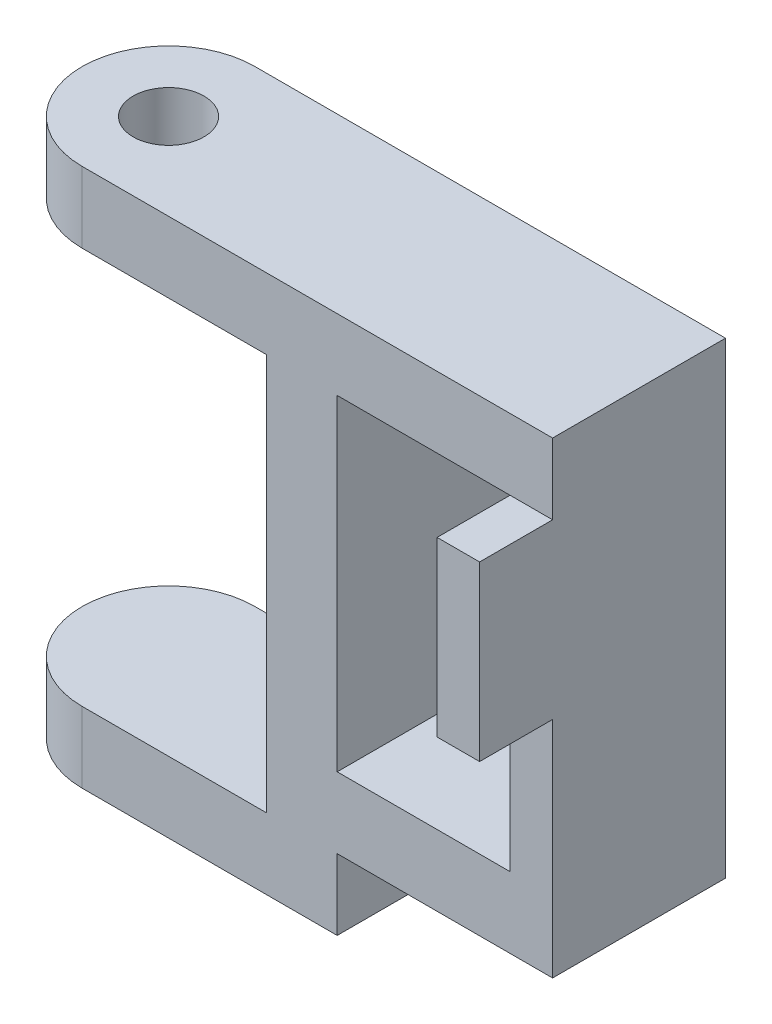
ISO-10303-21;
HEADER;
FILE_DESCRIPTION(('STEP AP214'),'2;1');
FILE_NAME('part.step','',(''),(''),'','','');
FILE_SCHEMA(('AUTOMOTIVE_DESIGN { 1 0 10303 214 1 1 1 1 }'));
ENDSEC;
DATA;
#1=APPLICATION_CONTEXT('core data for automotive mechanical design processes');
#2=APPLICATION_PROTOCOL_DEFINITION('international standard','automotive_design',2000,#1);
#3=PRODUCT_CONTEXT('',#1,'mechanical');
#4=PRODUCT('Part','Part','',(#3));
#5=PRODUCT_RELATED_PRODUCT_CATEGORY('part','',(#4));
#6=PRODUCT_DEFINITION_FORMATION('','',#4);
#7=PRODUCT_DEFINITION_CONTEXT('part definition',#1,'design');
#8=PRODUCT_DEFINITION('design','',#6,#7);
#9=PRODUCT_DEFINITION_SHAPE('','',#8);
#10=(LENGTH_UNIT() NAMED_UNIT(*) SI_UNIT(.MILLI.,.METRE.));
#11=(NAMED_UNIT(*) PLANE_ANGLE_UNIT() SI_UNIT($,.RADIAN.));
#12=(NAMED_UNIT(*) SI_UNIT($,.STERADIAN.) SOLID_ANGLE_UNIT());
#13=UNCERTAINTY_MEASURE_WITH_UNIT(LENGTH_MEASURE(1.E-05),#10,'distance_accuracy_value','');
#14=(GEOMETRIC_REPRESENTATION_CONTEXT(3) GLOBAL_UNCERTAINTY_ASSIGNED_CONTEXT((#13)) GLOBAL_UNIT_ASSIGNED_CONTEXT((#10,
#11,#12)) REPRESENTATION_CONTEXT('',''));
#15=CARTESIAN_POINT('',(0.,0.,0.));
#16=DIRECTION('',(0.,0.,1.));
#17=DIRECTION('',(1.,0.,0.));
#18=AXIS2_PLACEMENT_3D('',#15,#16,#17);
#19=CARTESIAN_POINT('',(0.,0.,12.2));
#20=DIRECTION('',(0.,0.,1.));
#21=DIRECTION('',(1.,0.,0.));
#22=AXIS2_PLACEMENT_3D('',#19,#20,#21);
#23=PLANE('',#22);
#24=DIRECTION('',(0.,-1.,0.));
#25=VECTOR('',#24,1.);
#26=CARTESIAN_POINT('',(-1.10788192656431,-6.58682111786425,12.2));
#27=LINE('',#26,#25);
#28=CARTESIAN_POINT('',(-1.10788192656431,9.21411364004409,12.2));
#29=VERTEX_POINT('',#28);
#30=CARTESIAN_POINT('',(-1.10788192656431,-6.58682111786425,12.2));
#31=VERTEX_POINT('',#30);
#32=EDGE_CURVE('E220',#29,#31,#27,.T.);
#33=ORIENTED_EDGE('',*,*,#32,.F.);
#34=DIRECTION('',(1.,0.,0.));
#35=VECTOR('',#34,1.);
#36=CARTESIAN_POINT('',(-4.10788192656431,9.21411364004409,12.2));
#37=LINE('',#36,#35);
#38=CARTESIAN_POINT('',(-4.10788192656431,9.21411364004409,12.2));
#39=VERTEX_POINT('',#38);
#40=EDGE_CURVE('E636',#39,#29,#37,.T.);
#41=ORIENTED_EDGE('',*,*,#40,.F.);
#42=DIRECTION('',(0.,1.,0.));
#43=VECTOR('',#42,1.);
#44=CARTESIAN_POINT('',(-4.10788192656431,-14.5888211178643,12.2));
#45=LINE('',#44,#43);
#46=CARTESIAN_POINT('',(-4.10788192656431,-1.58682111786425,12.2));
#47=VERTEX_POINT('',#46);
#48=EDGE_CURVE('E196',#47,#39,#45,.T.);
#49=ORIENTED_EDGE('',*,*,#48,.F.);
#50=DIRECTION('',(-1.,0.,0.));
#51=VECTOR('',#50,1.);
#52=CARTESIAN_POINT('',(-1.10788192656431,-1.58682111786425,12.2));
#53=LINE('',#52,#51);
#54=CARTESIAN_POINT('',(-16.3078819265643,-1.58682111786425,12.2));
#55=VERTEX_POINT('',#54);
#56=EDGE_CURVE('E69',#47,#55,#53,.T.);
#57=ORIENTED_EDGE('',*,*,#56,.T.);
#58=DIRECTION('',(0.,1.,0.));
#59=VECTOR('',#58,1.);
#60=CARTESIAN_POINT('',(-16.3078819265643,26.4131788821357,12.2));
#61=LINE('',#60,#59);
#62=CARTESIAN_POINT('',(-16.3078819265643,21.4141136400441,12.2));
#63=VERTEX_POINT('',#62);
#64=EDGE_CURVE('E308',#55,#63,#61,.T.);
#65=ORIENTED_EDGE('',*,*,#64,.T.);
#66=DIRECTION('',(-1.,0.,0.));
#67=VECTOR('',#66,1.);
#68=CARTESIAN_POINT('',(-1.10788192656431,21.4141136400441,12.2));
#69=LINE('',#68,#67);
#70=CARTESIAN_POINT('',(-4.10788192656431,21.4141136400441,12.2));
#71=VERTEX_POINT('',#70);
#72=EDGE_CURVE('E61',#71,#63,#69,.T.);
#73=ORIENTED_EDGE('',*,*,#72,.F.);
#74=DIRECTION('',(-1.,0.,0.));
#75=VECTOR('',#74,1.);
#76=CARTESIAN_POINT('',(-4.10788192656431,21.4141136400441,12.2));
#77=LINE('',#76,#75);
#78=CARTESIAN_POINT('',(-1.10788192656431,21.4141136400441,12.2));
#79=VERTEX_POINT('',#78);
#80=EDGE_CURVE('E192',#79,#71,#77,.T.);
#81=ORIENTED_EDGE('',*,*,#80,.F.);
#82=CARTESIAN_POINT('',(-1.10788192656431,26.4131788821357,12.2));
#83=VERTEX_POINT('',#82);
#84=EDGE_CURVE('E215',#83,#79,#27,.T.);
#85=ORIENTED_EDGE('',*,*,#84,.F.);
#86=DIRECTION('',(-1.,0.,0.));
#87=VECTOR('',#86,1.);
#88=CARTESIAN_POINT('',(-40.4078819265643,26.4131788821357,12.2));
#89=LINE('',#88,#87);
#90=CARTESIAN_POINT('',(-34.3078819265643,26.4131788821357,12.2));
#91=VERTEX_POINT('',#90);
#92=EDGE_CURVE('E313',#83,#91,#89,.T.);
#93=ORIENTED_EDGE('',*,*,#92,.T.);
#94=DIRECTION('',(0.,-1.,0.));
#95=VECTOR('',#94,1.);
#96=CARTESIAN_POINT('',(-34.3078819265643,90.9412032566802,12.2));
#97=LINE('',#96,#95);
#98=CARTESIAN_POINT('',(-34.3078819265643,21.4131788821357,12.2));
#99=VERTEX_POINT('',#98);
#100=EDGE_CURVE('E270',#91,#99,#97,.T.);
#101=ORIENTED_EDGE('',*,*,#100,.T.);
#102=DIRECTION('',(1.,0.,0.));
#103=VECTOR('',#102,1.);
#104=CARTESIAN_POINT('',(-40.4078819265643,21.4131788821357,12.2));
#105=LINE('',#104,#103);
#106=CARTESIAN_POINT('',(-21.3078819265643,21.4131788821357,12.2));
#107=VERTEX_POINT('',#106);
#108=EDGE_CURVE('E294',#99,#107,#105,.T.);
#109=ORIENTED_EDGE('',*,*,#108,.T.);
#110=DIRECTION('',(0.,-1.,0.));
#111=VECTOR('',#110,1.);
#112=CARTESIAN_POINT('',(-21.3078819265643,21.4131788821357,12.2));
#113=LINE('',#112,#111);
#114=CARTESIAN_POINT('',(-21.3078819265643,-6.58682111786425,12.2));
#115=VERTEX_POINT('',#114);
#116=EDGE_CURVE('E297',#107,#115,#113,.T.);
#117=ORIENTED_EDGE('',*,*,#116,.T.);
#118=DIRECTION('',(-1.,0.,0.));
#119=VECTOR('',#118,1.);
#120=CARTESIAN_POINT('',(-21.3078819265643,-6.58682111786425,12.2));
#121=LINE('',#120,#119);
#122=CARTESIAN_POINT('',(-34.3078819265643,-6.58682111786425,12.2));
#123=VERTEX_POINT('',#122);
#124=EDGE_CURVE('E301',#115,#123,#121,.T.);
#125=ORIENTED_EDGE('',*,*,#124,.T.);
#126=CARTESIAN_POINT('',(-34.3078819265643,-11.5868211178643,12.2));
#127=VERTEX_POINT('',#126);
#128=EDGE_CURVE('E263',#123,#127,#97,.T.);
#129=ORIENTED_EDGE('',*,*,#128,.T.);
#130=DIRECTION('',(1.,0.,0.));
#131=VECTOR('',#130,1.);
#132=CARTESIAN_POINT('',(-16.3078819265643,-11.5868211178643,12.2));
#133=LINE('',#132,#131);
#134=CARTESIAN_POINT('',(-16.3078819265643,-11.5868211178643,12.2));
#135=VERTEX_POINT('',#134);
#136=EDGE_CURVE('E305',#127,#135,#133,.T.);
#137=ORIENTED_EDGE('',*,*,#136,.T.);
#138=CARTESIAN_POINT('',(-16.3078819265643,-6.58682111786425,12.2));
#139=VERTEX_POINT('',#138);
#140=EDGE_CURVE('E309',#135,#139,#61,.T.);
#141=ORIENTED_EDGE('',*,*,#140,.T.);
#142=DIRECTION('',(-1.,0.,0.));
#143=VECTOR('',#142,1.);
#144=CARTESIAN_POINT('',(-1.10788192656431,-6.58682111786425,12.2));
#145=LINE('',#144,#143);
#146=EDGE_CURVE('E244',#31,#139,#145,.T.);
#147=ORIENTED_EDGE('',*,*,#146,.F.);
#148=EDGE_LOOP('',(#33,#41,#49,#57,#65,#73,#81,#85,#93,#101,#109,#117,#125,#129,#137,#141,#147));
#149=FACE_BOUND('',#148,.T.);
#150=ADVANCED_FACE('F45',(#149),#23,.T.);
#151=CARTESIAN_POINT('',(-16.3078819265643,26.4131788821357,12.2));
#152=DIRECTION('',(-1.,0.,0.));
#153=DIRECTION('',(0.,-1.,0.));
#154=AXIS2_PLACEMENT_3D('',#151,#152,#153);
#155=PLANE('',#154);
#156=DIRECTION('',(0.,0.,1.));
#157=VECTOR('',#156,1.);
#158=CARTESIAN_POINT('',(-16.3078819265643,-1.58682111786425,12.2));
#159=LINE('',#158,#157);
#160=CARTESIAN_POINT('',(-16.3078819265643,-1.58682111786425,0.));
#161=VERTEX_POINT('',#160);
#162=EDGE_CURVE('E230',#161,#55,#159,.T.);
#163=ORIENTED_EDGE('',*,*,#162,.F.);
#164=DIRECTION('',(0.,1.,0.));
#165=VECTOR('',#164,1.);
#166=CARTESIAN_POINT('',(-16.3078819265643,26.4131788821357,0.));
#167=LINE('',#166,#165);
#168=CARTESIAN_POINT('',(-16.3078819265643,21.4141136400441,0.));
#169=VERTEX_POINT('',#168);
#170=EDGE_CURVE('E330',#161,#169,#167,.T.);
#171=ORIENTED_EDGE('',*,*,#170,.T.);
#172=DIRECTION('',(0.,0.,-1.));
#173=VECTOR('',#172,1.);
#174=CARTESIAN_POINT('',(-16.3078819265643,21.4141136400441,12.2));
#175=LINE('',#174,#173);
#176=EDGE_CURVE('E231',#63,#169,#175,.T.);
#177=ORIENTED_EDGE('',*,*,#176,.F.);
#178=ORIENTED_EDGE('',*,*,#64,.F.);
#179=EDGE_LOOP('',(#163,#171,#177,#178));
#180=FACE_BOUND('',#179,.T.);
#181=ADVANCED_FACE('F408',(#180),#155,.F.);
#182=DIRECTION('',(0.,0.,-1.));
#183=VECTOR('',#182,1.);
#184=CARTESIAN_POINT('',(-16.3078819265643,-6.58682111786425,12.2));
#185=LINE('',#184,#183);
#186=CARTESIAN_POINT('',(-16.3078819265643,-6.58682111786425,0.));
#187=VERTEX_POINT('',#186);
#188=EDGE_CURVE('E226',#139,#187,#185,.T.);
#189=ORIENTED_EDGE('',*,*,#188,.F.);
#190=ORIENTED_EDGE('',*,*,#140,.F.);
#191=DIRECTION('',(0.,0.,-1.));
#192=VECTOR('',#191,1.);
#193=CARTESIAN_POINT('',(-16.3078819265643,-11.5868211178643,12.2));
#194=LINE('',#193,#192);
#195=CARTESIAN_POINT('',(-16.3078819265643,-11.5868211178643,0.));
#196=VERTEX_POINT('',#195);
#197=EDGE_CURVE('E317',#135,#196,#194,.T.);
#198=ORIENTED_EDGE('',*,*,#197,.T.);
#199=EDGE_CURVE('E331',#196,#187,#167,.T.);
#200=ORIENTED_EDGE('',*,*,#199,.T.);
#201=EDGE_LOOP('',(#189,#190,#198,#200));
#202=FACE_BOUND('',#201,.T.);
#203=ADVANCED_FACE('F388',(#202),#155,.F.);
#204=CARTESIAN_POINT('',(-40.4078819265643,21.4131788821357,12.2));
#205=DIRECTION('',(0.,1.,0.));
#206=DIRECTION('',(0.,0.,1.));
#207=AXIS2_PLACEMENT_3D('',#204,#205,#206);
#208=PLANE('',#207);
#209=CARTESIAN_POINT('',(-34.3078819265643,21.4131788821357,6.1));
#210=DIRECTION('',(0.,1.,0.));
#211=DIRECTION('',(0.,0.,1.));
#212=AXIS2_PLACEMENT_3D('',#209,#210,#211);
#213=CIRCLE('',#212,2.49999999999999);
#214=CARTESIAN_POINT('',(-34.3078819265643,21.4131788821357,8.59999999999999));
#215=VERTEX_POINT('',#214);
#216=EDGE_CURVE('E286',#215,#215,#213,.T.);
#217=ORIENTED_EDGE('',*,*,#216,.T.);
#218=EDGE_LOOP('',(#217));
#219=FACE_BOUND('',#218,.T.);
#220=CARTESIAN_POINT('',(-34.3078819265643,21.4131788821357,6.1));
#221=DIRECTION('',(0.,1.,0.));
#222=DIRECTION('',(0.,0.,1.));
#223=AXIS2_PLACEMENT_3D('',#220,#221,#222);
#224=CIRCLE('',#223,6.1);
#225=CARTESIAN_POINT('',(-34.3078819265643,21.4131788821357,0.));
#226=VERTEX_POINT('',#225);
#227=EDGE_CURVE('E281',#226,#99,#224,.T.);
#228=ORIENTED_EDGE('',*,*,#227,.F.);
#229=DIRECTION('',(1.,0.,0.));
#230=VECTOR('',#229,1.);
#231=CARTESIAN_POINT('',(-40.4078819265643,21.4131788821357,0.));
#232=LINE('',#231,#230);
#233=CARTESIAN_POINT('',(-21.3078819265643,21.4131788821357,0.));
#234=VERTEX_POINT('',#233);
#235=EDGE_CURVE('E290',#226,#234,#232,.T.);
#236=ORIENTED_EDGE('',*,*,#235,.T.);
#237=DIRECTION('',(0.,0.,-1.));
#238=VECTOR('',#237,1.);
#239=CARTESIAN_POINT('',(-21.3078819265643,21.4131788821357,12.2));
#240=LINE('',#239,#238);
#241=EDGE_CURVE('E343',#107,#234,#240,.T.);
#242=ORIENTED_EDGE('',*,*,#241,.F.);
#243=ORIENTED_EDGE('',*,*,#108,.F.);
#244=EDGE_LOOP('',(#228,#236,#242,#243));
#245=FACE_BOUND('',#244,.T.);
#246=ADVANCED_FACE('F47',(#219,#245),#208,.F.);
#247=CARTESIAN_POINT('',(-21.3078819265643,-6.58682111786425,12.2));
#248=DIRECTION('',(0.,-1.,0.));
#249=DIRECTION('',(1.,0.,0.));
#250=AXIS2_PLACEMENT_3D('',#247,#248,#249);
#251=PLANE('',#250);
#252=CARTESIAN_POINT('',(-34.3078819265643,-6.58682111786425,6.1));
#253=DIRECTION('',(0.,-1.,0.));
#254=DIRECTION('',(1.,0.,0.));
#255=AXIS2_PLACEMENT_3D('',#252,#253,#254);
#256=CIRCLE('',#255,6.1);
#257=CARTESIAN_POINT('',(-34.3078819265643,-6.58682111786425,0.));
#258=VERTEX_POINT('',#257);
#259=EDGE_CURVE('E278',#123,#258,#256,.T.);
#260=ORIENTED_EDGE('',*,*,#259,.F.);
#261=ORIENTED_EDGE('',*,*,#124,.F.);
#262=DIRECTION('',(0.,0.,-1.));
#263=VECTOR('',#262,1.);
#264=CARTESIAN_POINT('',(-21.3078819265643,-6.58682111786425,12.2));
#265=LINE('',#264,#263);
#266=CARTESIAN_POINT('',(-21.3078819265643,-6.58682111786425,0.));
#267=VERTEX_POINT('',#266);
#268=EDGE_CURVE('E340',#115,#267,#265,.T.);
#269=ORIENTED_EDGE('',*,*,#268,.T.);
#270=DIRECTION('',(-1.,0.,0.));
#271=VECTOR('',#270,1.);
#272=CARTESIAN_POINT('',(-21.3078819265643,-6.58682111786425,0.));
#273=LINE('',#272,#271);
#274=EDGE_CURVE('E323',#267,#258,#273,.T.);
#275=ORIENTED_EDGE('',*,*,#274,.T.);
#276=EDGE_LOOP('',(#260,#261,#269,#275));
#277=FACE_BOUND('',#276,.T.);
#278=ADVANCED_FACE('F363',(#277),#251,.F.);
#279=CARTESIAN_POINT('',(-16.3078819265643,-11.5868211178643,12.2));
#280=DIRECTION('',(0.,1.,0.));
#281=DIRECTION('',(-1.,0.,0.));
#282=AXIS2_PLACEMENT_3D('',#279,#280,#281);
#283=PLANE('',#282);
#284=CARTESIAN_POINT('',(-34.3078819265643,-11.5868211178643,6.1));
#285=DIRECTION('',(0.,1.,0.));
#286=DIRECTION('',(-1.,0.,0.));
#287=AXIS2_PLACEMENT_3D('',#284,#285,#286);
#288=CIRCLE('',#287,2.);
#289=CARTESIAN_POINT('',(-36.3078819265643,-11.5868211178643,6.1));
#290=VERTEX_POINT('',#289);
#291=EDGE_CURVE('E11',#290,#290,#288,.F.);
#292=ORIENTED_EDGE('',*,*,#291,.F.);
#293=EDGE_LOOP('',(#292));
#294=FACE_BOUND('',#293,.T.);
#295=CARTESIAN_POINT('',(-34.3078819265643,-11.5868211178643,6.1));
#296=DIRECTION('',(0.,1.,0.));
#297=DIRECTION('',(-1.,0.,0.));
#298=AXIS2_PLACEMENT_3D('',#295,#296,#297);
#299=CIRCLE('',#298,6.1);
#300=CARTESIAN_POINT('',(-34.3078819265643,-11.5868211178643,0.));
#301=VERTEX_POINT('',#300);
#302=EDGE_CURVE('E274',#301,#127,#299,.T.);
#303=ORIENTED_EDGE('',*,*,#302,.F.);
#304=DIRECTION('',(1.,0.,0.));
#305=VECTOR('',#304,1.);
#306=CARTESIAN_POINT('',(-16.3078819265643,-11.5868211178643,0.));
#307=LINE('',#306,#305);
#308=EDGE_CURVE('E327',#301,#196,#307,.T.);
#309=ORIENTED_EDGE('',*,*,#308,.T.);
#310=ORIENTED_EDGE('',*,*,#197,.F.);
#311=ORIENTED_EDGE('',*,*,#136,.F.);
#312=EDGE_LOOP('',(#303,#309,#310,#311));
#313=FACE_BOUND('',#312,.T.);
#314=ADVANCED_FACE('F392',(#294,#313),#283,.F.);
#315=CARTESIAN_POINT('',(-40.4078819265643,26.4131788821357,12.2));
#316=DIRECTION('',(0.,-1.,0.));
#317=DIRECTION('',(0.,0.,-1.));
#318=AXIS2_PLACEMENT_3D('',#315,#316,#317);
#319=PLANE('',#318);
#320=CARTESIAN_POINT('',(-34.3078819265643,26.4131788821357,6.1));
#321=DIRECTION('',(0.,1.,0.));
#322=DIRECTION('',(0.,0.,1.));
#323=AXIS2_PLACEMENT_3D('',#320,#321,#322);
#324=CIRCLE('',#323,2.49999999999999);
#325=CARTESIAN_POINT('',(-34.3078819265643,26.4131788821357,8.59999999999999));
#326=VERTEX_POINT('',#325);
#327=EDGE_CURVE('E285',#326,#326,#324,.T.);
#328=ORIENTED_EDGE('',*,*,#327,.F.);
#329=EDGE_LOOP('',(#328));
#330=FACE_BOUND('',#329,.T.);
#331=CARTESIAN_POINT('',(-34.3078819265643,26.4131788821357,6.1));
#332=DIRECTION('',(0.,-1.,0.));
#333=DIRECTION('',(0.,0.,-1.));
#334=AXIS2_PLACEMENT_3D('',#331,#332,#333);
#335=CIRCLE('',#334,6.1);
#336=CARTESIAN_POINT('',(-34.3078819265643,26.4131788821357,0.));
#337=VERTEX_POINT('',#336);
#338=EDGE_CURVE('E271',#91,#337,#335,.T.);
#339=ORIENTED_EDGE('',*,*,#338,.F.);
#340=ORIENTED_EDGE('',*,*,#92,.F.);
#341=DIRECTION('',(0.,0.,1.));
#342=VECTOR('',#341,1.);
#343=CARTESIAN_POINT('',(-1.10788192656431,26.4131788821357,12.2));
#344=LINE('',#343,#342);
#345=CARTESIAN_POINT('',(-1.10788192656431,26.4131788821357,0.));
#346=VERTEX_POINT('',#345);
#347=EDGE_CURVE('E254',#346,#83,#344,.T.);
#348=ORIENTED_EDGE('',*,*,#347,.F.);
#349=DIRECTION('',(-1.,0.,0.));
#350=VECTOR('',#349,1.);
#351=CARTESIAN_POINT('',(-40.4078819265643,26.4131788821357,0.));
#352=LINE('',#351,#350);
#353=EDGE_CURVE('E298',#346,#337,#352,.T.);
#354=ORIENTED_EDGE('',*,*,#353,.T.);
#355=EDGE_LOOP('',(#339,#340,#348,#354));
#356=FACE_BOUND('',#355,.T.);
#357=ADVANCED_FACE('F376',(#330,#356),#319,.F.);
#358=CARTESIAN_POINT('',(0.,0.,0.));
#359=DIRECTION('',(0.,0.,1.));
#360=DIRECTION('',(1.,0.,0.));
#361=AXIS2_PLACEMENT_3D('',#358,#359,#360);
#362=PLANE('',#361);
#363=DIRECTION('',(0.,1.,0.));
#364=VECTOR('',#363,1.);
#365=CARTESIAN_POINT('',(-4.10788192656431,-14.5888211178643,0.));
#366=LINE('',#365,#364);
#367=CARTESIAN_POINT('',(-4.10788192656431,-1.58682111786425,0.));
#368=VERTEX_POINT('',#367);
#369=CARTESIAN_POINT('',(-4.10788192656431,21.4141136400441,0.));
#370=VERTEX_POINT('',#369);
#371=EDGE_CURVE('E202',#368,#370,#366,.T.);
#372=ORIENTED_EDGE('',*,*,#371,.T.);
#373=DIRECTION('',(-1.,0.,0.));
#374=VECTOR('',#373,1.);
#375=CARTESIAN_POINT('',(-1.10788192656431,21.4141136400441,0.));
#376=LINE('',#375,#374);
#377=EDGE_CURVE('E251',#370,#169,#376,.T.);
#378=ORIENTED_EDGE('',*,*,#377,.T.);
#379=ORIENTED_EDGE('',*,*,#170,.F.);
#380=DIRECTION('',(-1.,0.,0.));
#381=VECTOR('',#380,1.);
#382=CARTESIAN_POINT('',(-1.10788192656431,-1.58682111786425,0.));
#383=LINE('',#382,#381);
#384=EDGE_CURVE('E237',#368,#161,#383,.T.);
#385=ORIENTED_EDGE('',*,*,#384,.F.);
#386=EDGE_LOOP('',(#372,#378,#379,#385));
#387=FACE_BOUND('',#386,.T.);
#388=DIRECTION('',(0.,-1.,0.));
#389=VECTOR('',#388,1.);
#390=CARTESIAN_POINT('',(-34.3078819265643,90.9412032566802,0.));
#391=LINE('',#390,#389);
#392=EDGE_CURVE('E54',#337,#226,#391,.T.);
#393=ORIENTED_EDGE('',*,*,#392,.F.);
#394=ORIENTED_EDGE('',*,*,#353,.F.);
#395=DIRECTION('',(0.,1.,0.));
#396=VECTOR('',#395,1.);
#397=CARTESIAN_POINT('',(-1.10788192656431,-6.58682111786425,0.));
#398=LINE('',#397,#396);
#399=CARTESIAN_POINT('',(-1.10788192656431,-6.58682111786425,0.));
#400=VERTEX_POINT('',#399);
#401=EDGE_CURVE('E223',#400,#346,#398,.T.);
#402=ORIENTED_EDGE('',*,*,#401,.F.);
#403=DIRECTION('',(-1.,0.,0.));
#404=VECTOR('',#403,1.);
#405=CARTESIAN_POINT('',(-1.10788192656431,-6.58682111786425,0.));
#406=LINE('',#405,#404);
#407=EDGE_CURVE('E240',#400,#187,#406,.T.);
#408=ORIENTED_EDGE('',*,*,#407,.T.);
#409=ORIENTED_EDGE('',*,*,#199,.F.);
#410=ORIENTED_EDGE('',*,*,#308,.F.);
#411=EDGE_CURVE('E267',#258,#301,#391,.T.);
#412=ORIENTED_EDGE('',*,*,#411,.F.);
#413=ORIENTED_EDGE('',*,*,#274,.F.);
#414=DIRECTION('',(0.,-1.,0.));
#415=VECTOR('',#414,1.);
#416=CARTESIAN_POINT('',(-21.3078819265643,21.4131788821357,0.));
#417=LINE('',#416,#415);
#418=EDGE_CURVE('E320',#234,#267,#417,.T.);
#419=ORIENTED_EDGE('',*,*,#418,.F.);
#420=ORIENTED_EDGE('',*,*,#235,.F.);
#421=EDGE_LOOP('',(#393,#394,#402,#408,#409,#410,#412,#413,#419,#420));
#422=FACE_BOUND('',#421,.T.);
#423=ADVANCED_FACE('F360',(#387,#422),#362,.F.);
#424=CARTESIAN_POINT('',(-21.3078819265643,21.4131788821357,12.2));
#425=DIRECTION('',(1.,0.,0.));
#426=DIRECTION('',(0.,1.,0.));
#427=AXIS2_PLACEMENT_3D('',#424,#425,#426);
#428=PLANE('',#427);
#429=ORIENTED_EDGE('',*,*,#418,.T.);
#430=ORIENTED_EDGE('',*,*,#268,.F.);
#431=ORIENTED_EDGE('',*,*,#116,.F.);
#432=ORIENTED_EDGE('',*,*,#241,.T.);
#433=EDGE_LOOP('',(#429,#430,#431,#432));
#434=FACE_BOUND('',#433,.T.);
#435=ADVANCED_FACE('F366',(#434),#428,.F.);
#436=CARTESIAN_POINT('',(-34.3078819265643,21.4131788821357,6.1));
#437=DIRECTION('',(0.,1.,0.));
#438=DIRECTION('',(0.,0.,1.));
#439=AXIS2_PLACEMENT_3D('',#436,#437,#438);
#440=CYLINDRICAL_SURFACE('',#439,2.49999999999999);
#441=ORIENTED_EDGE('',*,*,#216,.F.);
#442=EDGE_LOOP('',(#441));
#443=FACE_BOUND('',#442,.T.);
#444=ORIENTED_EDGE('',*,*,#327,.T.);
#445=EDGE_LOOP('',(#444));
#446=FACE_BOUND('',#445,.T.);
#447=ADVANCED_FACE('F418',(#443,#446),#440,.F.);
#448=CARTESIAN_POINT('',(-34.3078819265643,90.9412032566802,6.1));
#449=DIRECTION('',(0.,-1.,0.));
#450=DIRECTION('',(0.,0.,-1.));
#451=AXIS2_PLACEMENT_3D('',#448,#449,#450);
#452=CYLINDRICAL_SURFACE('',#451,6.1);
#453=ORIENTED_EDGE('',*,*,#338,.T.);
#454=ORIENTED_EDGE('',*,*,#392,.T.);
#455=ORIENTED_EDGE('',*,*,#227,.T.);
#456=ORIENTED_EDGE('',*,*,#100,.F.);
#457=EDGE_LOOP('',(#453,#454,#455,#456));
#458=FACE_BOUND('',#457,.T.);
#459=ADVANCED_FACE('F371',(#458),#452,.T.);
#460=ORIENTED_EDGE('',*,*,#128,.F.);
#461=ORIENTED_EDGE('',*,*,#259,.T.);
#462=ORIENTED_EDGE('',*,*,#411,.T.);
#463=ORIENTED_EDGE('',*,*,#302,.T.);
#464=EDGE_LOOP('',(#460,#461,#462,#463));
#465=FACE_BOUND('',#464,.T.);
#466=ADVANCED_FACE('F355',(#465),#452,.T.);
#467=CARTESIAN_POINT('',(-34.3078819265643,-14.5868211178643,6.1));
#468=DIRECTION('',(0.,1.,0.));
#469=DIRECTION('',(-1.,0.,0.));
#470=AXIS2_PLACEMENT_3D('',#467,#468,#469);
#471=CYLINDRICAL_SURFACE('',#470,2.);
#472=CARTESIAN_POINT('',(-34.3078819265643,-14.5868211178643,6.1));
#473=DIRECTION('',(0.,-1.,0.));
#474=DIRECTION('',(1.,0.,0.));
#475=AXIS2_PLACEMENT_3D('',#472,#473,#474);
#476=CIRCLE('',#475,2.);
#477=CARTESIAN_POINT('',(-32.3078819265643,-14.5868211178643,6.1));
#478=VERTEX_POINT('',#477);
#479=EDGE_CURVE('E248',#478,#478,#476,.T.);
#480=ORIENTED_EDGE('',*,*,#479,.F.);
#481=EDGE_LOOP('',(#480));
#482=FACE_BOUND('',#481,.T.);
#483=ORIENTED_EDGE('',*,*,#291,.T.);
#484=EDGE_LOOP('',(#483));
#485=FACE_BOUND('',#484,.T.);
#486=ADVANCED_FACE('F457',(#482,#485),#471,.T.);
#487=CARTESIAN_POINT('',(-34.3078819265643,-14.5868211178643,6.1));
#488=DIRECTION('',(0.,-1.,0.));
#489=DIRECTION('',(1.,0.,0.));
#490=AXIS2_PLACEMENT_3D('',#487,#488,#489);
#491=PLANE('',#490);
#492=ORIENTED_EDGE('',*,*,#479,.T.);
#493=EDGE_LOOP('',(#492));
#494=FACE_BOUND('',#493,.T.);
#495=ADVANCED_FACE('F460',(#494),#491,.T.);
#496=CARTESIAN_POINT('',(-1.10788192656431,21.4141136400441,12.2));
#497=DIRECTION('',(0.,1.,0.));
#498=DIRECTION('',(0.,0.,1.));
#499=AXIS2_PLACEMENT_3D('',#496,#497,#498);
#500=PLANE('',#499);
#501=ORIENTED_EDGE('',*,*,#377,.F.);
#502=DIRECTION('',(0.,0.,1.));
#503=VECTOR('',#502,1.);
#504=CARTESIAN_POINT('',(-4.10788192656431,21.4141136400441,0.));
#505=LINE('',#504,#503);
#506=EDGE_CURVE('E198',#370,#71,#505,.T.);
#507=ORIENTED_EDGE('',*,*,#506,.T.);
#508=ORIENTED_EDGE('',*,*,#72,.T.);
#509=ORIENTED_EDGE('',*,*,#176,.T.);
#510=EDGE_LOOP('',(#501,#507,#508,#509));
#511=FACE_BOUND('',#510,.T.);
#512=ADVANCED_FACE('F434',(#511),#500,.F.);
#513=CARTESIAN_POINT('',(-1.10788192656431,-6.58682111786425,12.2));
#514=DIRECTION('',(0.,1.,0.));
#515=DIRECTION('',(0.,0.,1.));
#516=AXIS2_PLACEMENT_3D('',#513,#514,#515);
#517=PLANE('',#516);
#518=ORIENTED_EDGE('',*,*,#188,.T.);
#519=ORIENTED_EDGE('',*,*,#407,.F.);
#520=DIRECTION('',(0.,0.,-1.));
#521=VECTOR('',#520,1.);
#522=CARTESIAN_POINT('',(-1.10788192656431,-6.58682111786425,12.2));
#523=LINE('',#522,#521);
#524=EDGE_CURVE('E219',#31,#400,#523,.T.);
#525=ORIENTED_EDGE('',*,*,#524,.F.);
#526=ORIENTED_EDGE('',*,*,#146,.T.);
#527=EDGE_LOOP('',(#518,#519,#525,#526));
#528=FACE_BOUND('',#527,.T.);
#529=ADVANCED_FACE('F385',(#528),#517,.F.);
#530=CARTESIAN_POINT('',(-1.10788192656431,-1.58682111786425,12.2));
#531=DIRECTION('',(0.,-1.,0.));
#532=DIRECTION('',(0.,0.,-1.));
#533=AXIS2_PLACEMENT_3D('',#530,#531,#532);
#534=PLANE('',#533);
#535=ORIENTED_EDGE('',*,*,#56,.F.);
#536=DIRECTION('',(0.,0.,1.));
#537=VECTOR('',#536,1.);
#538=CARTESIAN_POINT('',(-4.10788192656431,-1.58682111786425,0.));
#539=LINE('',#538,#537);
#540=EDGE_CURVE('E210',#368,#47,#539,.T.);
#541=ORIENTED_EDGE('',*,*,#540,.F.);
#542=ORIENTED_EDGE('',*,*,#384,.T.);
#543=ORIENTED_EDGE('',*,*,#162,.T.);
#544=EDGE_LOOP('',(#535,#541,#542,#543));
#545=FACE_BOUND('',#544,.T.);
#546=ADVANCED_FACE('F467',(#545),#534,.F.);
#547=CARTESIAN_POINT('',(-1.10788192656431,0.,0.));
#548=DIRECTION('',(-1.,0.,0.));
#549=DIRECTION('',(0.,0.,1.));
#550=AXIS2_PLACEMENT_3D('',#547,#548,#549);
#551=PLANE('',#550);
#552=ORIENTED_EDGE('',*,*,#84,.T.);
#553=DIRECTION('',(0.,0.,-1.));
#554=VECTOR('',#553,1.);
#555=CARTESIAN_POINT('',(-1.10788192656431,21.4141136400441,17.35));
#556=LINE('',#555,#554);
#557=CARTESIAN_POINT('',(-1.10788192656431,21.4141136400441,17.35));
#558=VERTEX_POINT('',#557);
#559=EDGE_CURVE('E204',#558,#79,#556,.T.);
#560=ORIENTED_EDGE('',*,*,#559,.F.);
#561=DIRECTION('',(0.,1.,0.));
#562=VECTOR('',#561,1.);
#563=CARTESIAN_POINT('',(-1.10788192656431,21.4141136400441,17.35));
#564=LINE('',#563,#562);
#565=CARTESIAN_POINT('',(-1.10788192656431,9.21411364004409,17.35));
#566=VERTEX_POINT('',#565);
#567=EDGE_CURVE('E182',#566,#558,#564,.T.);
#568=ORIENTED_EDGE('',*,*,#567,.F.);
#569=DIRECTION('',(0.,0.,-1.));
#570=VECTOR('',#569,1.);
#571=CARTESIAN_POINT('',(-1.10788192656431,9.21411364004409,17.35));
#572=LINE('',#571,#570);
#573=EDGE_CURVE('E178',#566,#29,#572,.T.);
#574=ORIENTED_EDGE('',*,*,#573,.T.);
#575=ORIENTED_EDGE('',*,*,#32,.T.);
#576=ORIENTED_EDGE('',*,*,#524,.T.);
#577=ORIENTED_EDGE('',*,*,#401,.T.);
#578=ORIENTED_EDGE('',*,*,#347,.T.);
#579=EDGE_LOOP('',(#552,#560,#568,#574,#575,#576,#577,#578));
#580=FACE_BOUND('',#579,.T.);
#581=ADVANCED_FACE('F380',(#580),#551,.F.);
#582=CARTESIAN_POINT('',(-4.10788192656431,-14.5888211178643,0.));
#583=DIRECTION('',(-1.,0.,0.));
#584=DIRECTION('',(0.,0.,1.));
#585=AXIS2_PLACEMENT_3D('',#582,#583,#584);
#586=PLANE('',#585);
#587=ORIENTED_EDGE('',*,*,#371,.F.);
#588=ORIENTED_EDGE('',*,*,#540,.T.);
#589=ORIENTED_EDGE('',*,*,#48,.T.);
#590=DIRECTION('',(0.,0.,-1.));
#591=VECTOR('',#590,1.);
#592=CARTESIAN_POINT('',(-4.10788192656431,9.21411364004409,17.35));
#593=LINE('',#592,#591);
#594=CARTESIAN_POINT('',(-4.10788192656431,9.21411364004409,17.35));
#595=VERTEX_POINT('',#594);
#596=EDGE_CURVE('E175',#595,#39,#593,.T.);
#597=ORIENTED_EDGE('',*,*,#596,.F.);
#598=DIRECTION('',(0.,-1.,0.));
#599=VECTOR('',#598,1.);
#600=CARTESIAN_POINT('',(-4.10788192656431,21.4141136400441,17.35));
#601=LINE('',#600,#599);
#602=CARTESIAN_POINT('',(-4.10788192656431,21.4141136400441,17.35));
#603=VERTEX_POINT('',#602);
#604=EDGE_CURVE('E183',#603,#595,#601,.T.);
#605=ORIENTED_EDGE('',*,*,#604,.F.);
#606=DIRECTION('',(0.,0.,-1.));
#607=VECTOR('',#606,1.);
#608=CARTESIAN_POINT('',(-4.10788192656431,21.4141136400441,17.35));
#609=LINE('',#608,#607);
#610=EDGE_CURVE('E432',#603,#71,#609,.T.);
#611=ORIENTED_EDGE('',*,*,#610,.T.);
#612=ORIENTED_EDGE('',*,*,#506,.F.);
#613=EDGE_LOOP('',(#587,#588,#589,#597,#605,#611,#612));
#614=FACE_BOUND('',#613,.T.);
#615=ADVANCED_FACE('F195',(#614),#586,.T.);
#616=CARTESIAN_POINT('',(-4.10788192656431,9.21411364004409,17.35));
#617=DIRECTION('',(0.,1.,0.));
#618=DIRECTION('',(0.,0.,1.));
#619=AXIS2_PLACEMENT_3D('',#616,#617,#618);
#620=PLANE('',#619);
#621=ORIENTED_EDGE('',*,*,#40,.T.);
#622=ORIENTED_EDGE('',*,*,#573,.F.);
#623=DIRECTION('',(1.,0.,0.));
#624=VECTOR('',#623,1.);
#625=CARTESIAN_POINT('',(-4.10788192656431,9.21411364004409,17.35));
#626=LINE('',#625,#624);
#627=EDGE_CURVE('E171',#595,#566,#626,.T.);
#628=ORIENTED_EDGE('',*,*,#627,.F.);
#629=ORIENTED_EDGE('',*,*,#596,.T.);
#630=EDGE_LOOP('',(#621,#622,#628,#629));
#631=FACE_BOUND('',#630,.T.);
#632=ADVANCED_FACE('F173',(#631),#620,.F.);
#633=CARTESIAN_POINT('',(-4.10788192656431,21.4141136400441,17.35));
#634=DIRECTION('',(0.,-1.,0.));
#635=DIRECTION('',(0.,0.,-1.));
#636=AXIS2_PLACEMENT_3D('',#633,#634,#635);
#637=PLANE('',#636);
#638=ORIENTED_EDGE('',*,*,#80,.T.);
#639=ORIENTED_EDGE('',*,*,#610,.F.);
#640=DIRECTION('',(-1.,0.,0.));
#641=VECTOR('',#640,1.);
#642=CARTESIAN_POINT('',(-4.10788192656431,21.4141136400441,17.35));
#643=LINE('',#642,#641);
#644=EDGE_CURVE('E188',#558,#603,#643,.T.);
#645=ORIENTED_EDGE('',*,*,#644,.F.);
#646=ORIENTED_EDGE('',*,*,#559,.T.);
#647=EDGE_LOOP('',(#638,#639,#645,#646));
#648=FACE_BOUND('',#647,.T.);
#649=ADVANCED_FACE('F476',(#648),#637,.F.);
#650=CARTESIAN_POINT('',(0.,0.,17.35));
#651=DIRECTION('',(0.,0.,1.));
#652=DIRECTION('',(1.,0.,0.));
#653=AXIS2_PLACEMENT_3D('',#650,#651,#652);
#654=PLANE('',#653);
#655=ORIENTED_EDGE('',*,*,#604,.T.);
#656=ORIENTED_EDGE('',*,*,#627,.T.);
#657=ORIENTED_EDGE('',*,*,#567,.T.);
#658=ORIENTED_EDGE('',*,*,#644,.T.);
#659=EDGE_LOOP('',(#655,#656,#657,#658));
#660=FACE_BOUND('',#659,.T.);
#661=ADVANCED_FACE('F186',(#660),#654,.T.);
#662=CLOSED_SHELL('',(#150,#181,#203,#246,#278,#314,#357,#423,#435,#447,#459,#466,#486,#495,
#512,#529,#546,#581,#615,#632,#649,#661));
#663=MANIFOLD_SOLID_BREP('B2',#662);
#664=ADVANCED_BREP_SHAPE_REPRESENTATION('',(#18,#663),#14);
#665=SHAPE_DEFINITION_REPRESENTATION(#9,#664);
ENDSEC;
END-ISO-10303-21;
